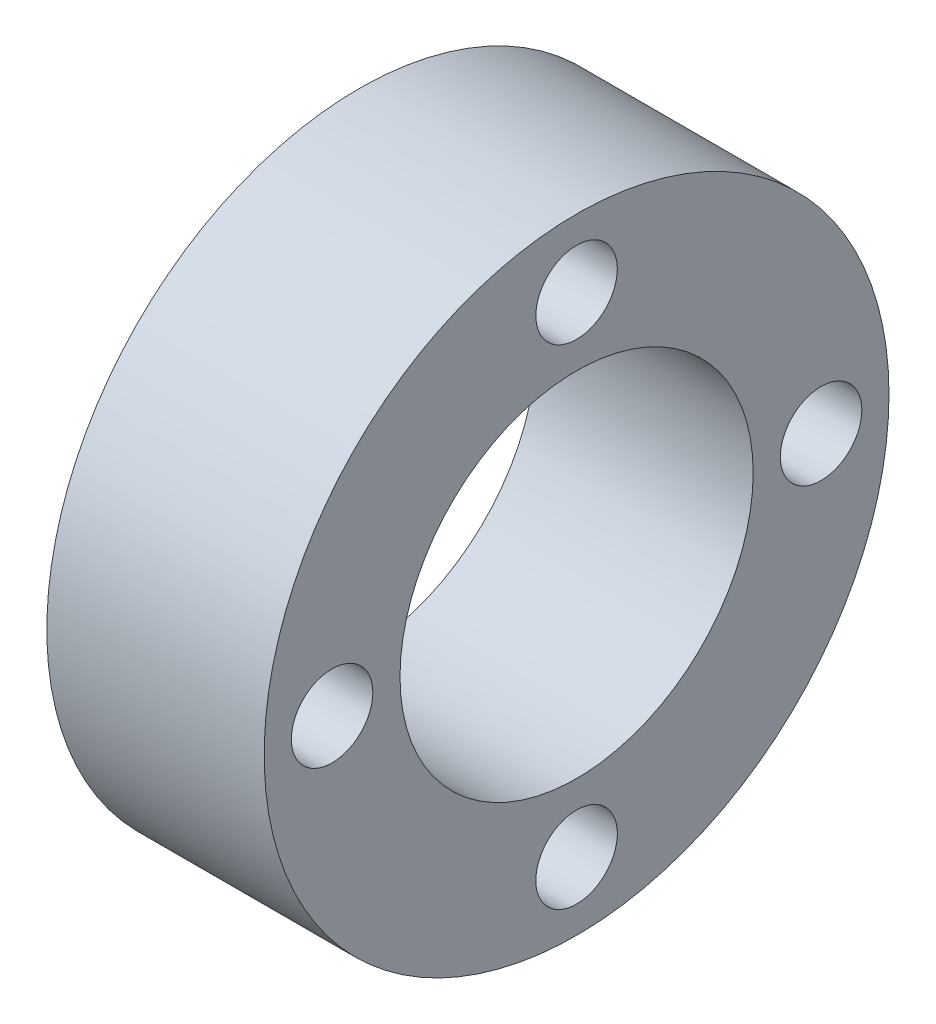
ISO-10303-21;
HEADER;
FILE_DESCRIPTION(('STEP AP214'),'2;1');
FILE_NAME('part.step','',(''),(''),'','','');
FILE_SCHEMA(('AUTOMOTIVE_DESIGN { 1 0 10303 214 1 1 1 1 }'));
ENDSEC;
DATA;
#1=APPLICATION_CONTEXT('core data for automotive mechanical design processes');
#2=APPLICATION_PROTOCOL_DEFINITION('international standard','automotive_design',2000,#1);
#3=PRODUCT_CONTEXT('',#1,'mechanical');
#4=PRODUCT('Part','Part','',(#3));
#5=PRODUCT_RELATED_PRODUCT_CATEGORY('part','',(#4));
#6=PRODUCT_DEFINITION_FORMATION('','',#4);
#7=PRODUCT_DEFINITION_CONTEXT('part definition',#1,'design');
#8=PRODUCT_DEFINITION('design','',#6,#7);
#9=PRODUCT_DEFINITION_SHAPE('','',#8);
#10=(LENGTH_UNIT() NAMED_UNIT(*) SI_UNIT(.MILLI.,.METRE.));
#11=(NAMED_UNIT(*) PLANE_ANGLE_UNIT() SI_UNIT($,.RADIAN.));
#12=(NAMED_UNIT(*) SI_UNIT($,.STERADIAN.) SOLID_ANGLE_UNIT());
#13=UNCERTAINTY_MEASURE_WITH_UNIT(LENGTH_MEASURE(1.E-05),#10,'distance_accuracy_value','');
#14=(GEOMETRIC_REPRESENTATION_CONTEXT(3) GLOBAL_UNCERTAINTY_ASSIGNED_CONTEXT((#13)) GLOBAL_UNIT_ASSIGNED_CONTEXT((#10,
#11,#12)) REPRESENTATION_CONTEXT('',''));
#15=CARTESIAN_POINT('',(0.,0.,0.));
#16=DIRECTION('',(0.,0.,1.));
#17=DIRECTION('',(1.,0.,0.));
#18=AXIS2_PLACEMENT_3D('',#15,#16,#17);
#19=CARTESIAN_POINT('',(8.,0.,0.));
#20=DIRECTION('',(1.,0.,0.));
#21=DIRECTION('',(0.,0.,-1.));
#22=AXIS2_PLACEMENT_3D('',#19,#20,#21);
#23=PLANE('',#22);
#24=CARTESIAN_POINT('',(8.,0.,-9.));
#25=DIRECTION('',(1.,0.,0.));
#26=DIRECTION('',(0.,-1.,0.));
#27=AXIS2_PLACEMENT_3D('',#24,#25,#26);
#28=CIRCLE('',#27,1.5);
#29=CARTESIAN_POINT('',(8.,-1.49999999999991,-9.00000000000001));
#30=VERTEX_POINT('',#29);
#31=EDGE_CURVE('E74',#30,#30,#28,.T.);
#32=ORIENTED_EDGE('',*,*,#31,.F.);
#33=EDGE_LOOP('',(#32));
#34=FACE_BOUND('',#33,.T.);
#35=CARTESIAN_POINT('',(8.,-9.,0.));
#36=DIRECTION('',(1.,0.,0.));
#37=DIRECTION('',(0.,0.,1.));
#38=AXIS2_PLACEMENT_3D('',#35,#36,#37);
#39=CIRCLE('',#38,1.5);
#40=CARTESIAN_POINT('',(8.,-9.00000000000001,1.49999999999994));
#41=VERTEX_POINT('',#40);
#42=EDGE_CURVE('E68',#41,#41,#39,.T.);
#43=ORIENTED_EDGE('',*,*,#42,.F.);
#44=EDGE_LOOP('',(#43));
#45=FACE_BOUND('',#44,.T.);
#46=CARTESIAN_POINT('',(8.,0.,9.));
#47=DIRECTION('',(1.,0.,0.));
#48=DIRECTION('',(0.,1.,0.));
#49=AXIS2_PLACEMENT_3D('',#46,#47,#48);
#50=CIRCLE('',#49,1.5);
#51=CARTESIAN_POINT('',(8.,1.49999999999997,9.00000000000001));
#52=VERTEX_POINT('',#51);
#53=EDGE_CURVE('E62',#52,#52,#50,.T.);
#54=ORIENTED_EDGE('',*,*,#53,.F.);
#55=EDGE_LOOP('',(#54));
#56=FACE_BOUND('',#55,.T.);
#57=CARTESIAN_POINT('',(8.,9.,0.));
#58=DIRECTION('',(1.,0.,0.));
#59=DIRECTION('',(0.,0.,-1.));
#60=AXIS2_PLACEMENT_3D('',#57,#58,#59);
#61=CIRCLE('',#60,1.5);
#62=CARTESIAN_POINT('',(8.,9.,-1.5));
#63=VERTEX_POINT('',#62);
#64=EDGE_CURVE('E56',#63,#63,#61,.T.);
#65=ORIENTED_EDGE('',*,*,#64,.F.);
#66=EDGE_LOOP('',(#65));
#67=FACE_BOUND('',#66,.T.);
#68=CARTESIAN_POINT('',(8.,0.,0.));
#69=DIRECTION('',(1.,0.,0.));
#70=DIRECTION('',(0.,0.,-1.));
#71=AXIS2_PLACEMENT_3D('',#68,#69,#70);
#72=CIRCLE('',#71,11.5);
#73=CARTESIAN_POINT('',(8.,0.,-11.5));
#74=VERTEX_POINT('',#73);
#75=EDGE_CURVE('E10',#74,#74,#72,.T.);
#76=ORIENTED_EDGE('',*,*,#75,.T.);
#77=EDGE_LOOP('',(#76));
#78=FACE_BOUND('',#77,.T.);
#79=CARTESIAN_POINT('',(8.,0.,0.));
#80=DIRECTION('',(1.,0.,0.));
#81=DIRECTION('',(0.,0.,-1.));
#82=AXIS2_PLACEMENT_3D('',#79,#80,#81);
#83=CIRCLE('',#82,6.5);
#84=CARTESIAN_POINT('',(8.,0.,-6.5));
#85=VERTEX_POINT('',#84);
#86=EDGE_CURVE('E48',#85,#85,#83,.T.);
#87=ORIENTED_EDGE('',*,*,#86,.F.);
#88=EDGE_LOOP('',(#87));
#89=FACE_BOUND('',#88,.T.);
#90=ADVANCED_FACE('F37',(#34,#45,#56,#67,#78,#89),#23,.T.);
#91=CARTESIAN_POINT('',(0.,0.,0.));
#92=DIRECTION('',(1.,0.,0.));
#93=DIRECTION('',(0.,0.,-1.));
#94=AXIS2_PLACEMENT_3D('',#91,#92,#93);
#95=PLANE('',#94);
#96=CARTESIAN_POINT('',(0.,0.,0.));
#97=DIRECTION('',(1.,0.,0.));
#98=DIRECTION('',(0.,0.,-1.));
#99=AXIS2_PLACEMENT_3D('',#96,#97,#98);
#100=CIRCLE('',#99,11.5);
#101=CARTESIAN_POINT('',(0.,0.,-11.5));
#102=VERTEX_POINT('',#101);
#103=EDGE_CURVE('E41',#102,#102,#100,.T.);
#104=ORIENTED_EDGE('',*,*,#103,.F.);
#105=EDGE_LOOP('',(#104));
#106=FACE_BOUND('',#105,.T.);
#107=CARTESIAN_POINT('',(0.,0.,0.));
#108=DIRECTION('',(1.,0.,0.));
#109=DIRECTION('',(0.,0.,-1.));
#110=AXIS2_PLACEMENT_3D('',#107,#108,#109);
#111=CIRCLE('',#110,6.5);
#112=CARTESIAN_POINT('',(0.,0.,-6.5));
#113=VERTEX_POINT('',#112);
#114=EDGE_CURVE('E50',#113,#113,#111,.T.);
#115=ORIENTED_EDGE('',*,*,#114,.T.);
#116=EDGE_LOOP('',(#115));
#117=FACE_BOUND('',#116,.T.);
#118=ADVANCED_FACE('F91',(#106,#117),#95,.F.);
#119=CARTESIAN_POINT('',(8.,0.,0.));
#120=DIRECTION('',(-1.,0.,0.));
#121=DIRECTION('',(0.,0.,1.));
#122=AXIS2_PLACEMENT_3D('',#119,#120,#121);
#123=CYLINDRICAL_SURFACE('',#122,11.5);
#124=ORIENTED_EDGE('',*,*,#75,.F.);
#125=EDGE_LOOP('',(#124));
#126=FACE_BOUND('',#125,.T.);
#127=ORIENTED_EDGE('',*,*,#103,.T.);
#128=EDGE_LOOP('',(#127));
#129=FACE_BOUND('',#128,.T.);
#130=ADVANCED_FACE('F39',(#126,#129),#123,.T.);
#131=CARTESIAN_POINT('',(8.,0.,0.));
#132=DIRECTION('',(-1.,0.,0.));
#133=DIRECTION('',(0.,0.,1.));
#134=AXIS2_PLACEMENT_3D('',#131,#132,#133);
#135=CYLINDRICAL_SURFACE('',#134,6.5);
#136=ORIENTED_EDGE('',*,*,#86,.T.);
#137=EDGE_LOOP('',(#136));
#138=FACE_BOUND('',#137,.T.);
#139=ORIENTED_EDGE('',*,*,#114,.F.);
#140=EDGE_LOOP('',(#139));
#141=FACE_BOUND('',#140,.T.);
#142=ADVANCED_FACE('F101',(#138,#141),#135,.F.);
#143=CARTESIAN_POINT('',(5.,9.,0.));
#144=DIRECTION('',(1.,0.,0.));
#145=DIRECTION('',(0.,0.,-1.));
#146=AXIS2_PLACEMENT_3D('',#143,#144,#145);
#147=CYLINDRICAL_SURFACE('',#146,1.5);
#148=CARTESIAN_POINT('',(5.,9.,0.));
#149=DIRECTION('',(1.,0.,0.));
#150=DIRECTION('',(0.,0.,-1.));
#151=AXIS2_PLACEMENT_3D('',#148,#149,#150);
#152=CIRCLE('',#151,1.5);
#153=CARTESIAN_POINT('',(5.,9.,-1.5));
#154=VERTEX_POINT('',#153);
#155=EDGE_CURVE('E53',#154,#154,#152,.T.);
#156=ORIENTED_EDGE('',*,*,#155,.F.);
#157=EDGE_LOOP('',(#156));
#158=FACE_BOUND('',#157,.T.);
#159=ORIENTED_EDGE('',*,*,#64,.T.);
#160=EDGE_LOOP('',(#159));
#161=FACE_BOUND('',#160,.T.);
#162=ADVANCED_FACE('F104',(#158,#161),#147,.F.);
#163=CARTESIAN_POINT('',(5.,9.,0.));
#164=DIRECTION('',(1.,0.,0.));
#165=DIRECTION('',(0.,0.,-1.));
#166=AXIS2_PLACEMENT_3D('',#163,#164,#165);
#167=PLANE('',#166);
#168=ORIENTED_EDGE('',*,*,#155,.T.);
#169=EDGE_LOOP('',(#168));
#170=FACE_BOUND('',#169,.T.);
#171=ADVANCED_FACE('F118',(#170),#167,.T.);
#172=CARTESIAN_POINT('',(5.,0.,9.));
#173=DIRECTION('',(1.,0.,0.));
#174=DIRECTION('',(0.,0.,-1.));
#175=AXIS2_PLACEMENT_3D('',#172,#173,#174);
#176=CYLINDRICAL_SURFACE('',#175,1.5);
#177=CARTESIAN_POINT('',(5.,0.,9.));
#178=DIRECTION('',(1.,0.,0.));
#179=DIRECTION('',(0.,1.,0.));
#180=AXIS2_PLACEMENT_3D('',#177,#178,#179);
#181=CIRCLE('',#180,1.5);
#182=CARTESIAN_POINT('',(5.,1.49999999999997,9.00000000000001));
#183=VERTEX_POINT('',#182);
#184=EDGE_CURVE('E59',#183,#183,#181,.T.);
#185=ORIENTED_EDGE('',*,*,#184,.F.);
#186=EDGE_LOOP('',(#185));
#187=FACE_BOUND('',#186,.T.);
#188=ORIENTED_EDGE('',*,*,#53,.T.);
#189=EDGE_LOOP('',(#188));
#190=FACE_BOUND('',#189,.T.);
#191=ADVANCED_FACE('F122',(#187,#190),#176,.F.);
#192=CARTESIAN_POINT('',(5.,0.,9.));
#193=DIRECTION('',(1.,0.,0.));
#194=DIRECTION('',(0.,1.,0.));
#195=AXIS2_PLACEMENT_3D('',#192,#193,#194);
#196=PLANE('',#195);
#197=ORIENTED_EDGE('',*,*,#184,.T.);
#198=EDGE_LOOP('',(#197));
#199=FACE_BOUND('',#198,.T.);
#200=ADVANCED_FACE('F126',(#199),#196,.T.);
#201=CARTESIAN_POINT('',(5.,-9.,0.));
#202=DIRECTION('',(1.,0.,0.));
#203=DIRECTION('',(0.,0.,-1.));
#204=AXIS2_PLACEMENT_3D('',#201,#202,#203);
#205=CYLINDRICAL_SURFACE('',#204,1.5);
#206=CARTESIAN_POINT('',(5.,-9.,0.));
#207=DIRECTION('',(1.,0.,0.));
#208=DIRECTION('',(0.,0.,1.));
#209=AXIS2_PLACEMENT_3D('',#206,#207,#208);
#210=CIRCLE('',#209,1.5);
#211=CARTESIAN_POINT('',(5.,-9.00000000000001,1.49999999999994));
#212=VERTEX_POINT('',#211);
#213=EDGE_CURVE('E65',#212,#212,#210,.T.);
#214=ORIENTED_EDGE('',*,*,#213,.F.);
#215=EDGE_LOOP('',(#214));
#216=FACE_BOUND('',#215,.T.);
#217=ORIENTED_EDGE('',*,*,#42,.T.);
#218=EDGE_LOOP('',(#217));
#219=FACE_BOUND('',#218,.T.);
#220=ADVANCED_FACE('F130',(#216,#219),#205,.F.);
#221=CARTESIAN_POINT('',(5.,-9.,0.));
#222=DIRECTION('',(1.,0.,0.));
#223=DIRECTION('',(0.,0.,1.));
#224=AXIS2_PLACEMENT_3D('',#221,#222,#223);
#225=PLANE('',#224);
#226=ORIENTED_EDGE('',*,*,#213,.T.);
#227=EDGE_LOOP('',(#226));
#228=FACE_BOUND('',#227,.T.);
#229=ADVANCED_FACE('F85',(#228),#225,.T.);
#230=CARTESIAN_POINT('',(5.,0.,-9.));
#231=DIRECTION('',(1.,0.,0.));
#232=DIRECTION('',(0.,0.,-1.));
#233=AXIS2_PLACEMENT_3D('',#230,#231,#232);
#234=CYLINDRICAL_SURFACE('',#233,1.5);
#235=CARTESIAN_POINT('',(5.,0.,-9.));
#236=DIRECTION('',(1.,0.,0.));
#237=DIRECTION('',(0.,-1.,0.));
#238=AXIS2_PLACEMENT_3D('',#235,#236,#237);
#239=CIRCLE('',#238,1.5);
#240=CARTESIAN_POINT('',(5.,-1.49999999999991,-9.00000000000001));
#241=VERTEX_POINT('',#240);
#242=EDGE_CURVE('E71',#241,#241,#239,.T.);
#243=ORIENTED_EDGE('',*,*,#242,.F.);
#244=EDGE_LOOP('',(#243));
#245=FACE_BOUND('',#244,.T.);
#246=ORIENTED_EDGE('',*,*,#31,.T.);
#247=EDGE_LOOP('',(#246));
#248=FACE_BOUND('',#247,.T.);
#249=ADVANCED_FACE('F82',(#245,#248),#234,.F.);
#250=CARTESIAN_POINT('',(5.,0.,-9.));
#251=DIRECTION('',(1.,0.,0.));
#252=DIRECTION('',(0.,-1.,0.));
#253=AXIS2_PLACEMENT_3D('',#250,#251,#252);
#254=PLANE('',#253);
#255=ORIENTED_EDGE('',*,*,#242,.T.);
#256=EDGE_LOOP('',(#255));
#257=FACE_BOUND('',#256,.T.);
#258=ADVANCED_FACE('F80',(#257),#254,.T.);
#259=CLOSED_SHELL('',(#90,#118,#130,#142,#162,#171,#191,#200,#220,#229,#249,#258));
#260=MANIFOLD_SOLID_BREP('B2',#259);
#261=ADVANCED_BREP_SHAPE_REPRESENTATION('',(#18,#260),#14);
#262=SHAPE_DEFINITION_REPRESENTATION(#9,#261);
ENDSEC;
END-ISO-10303-21;
